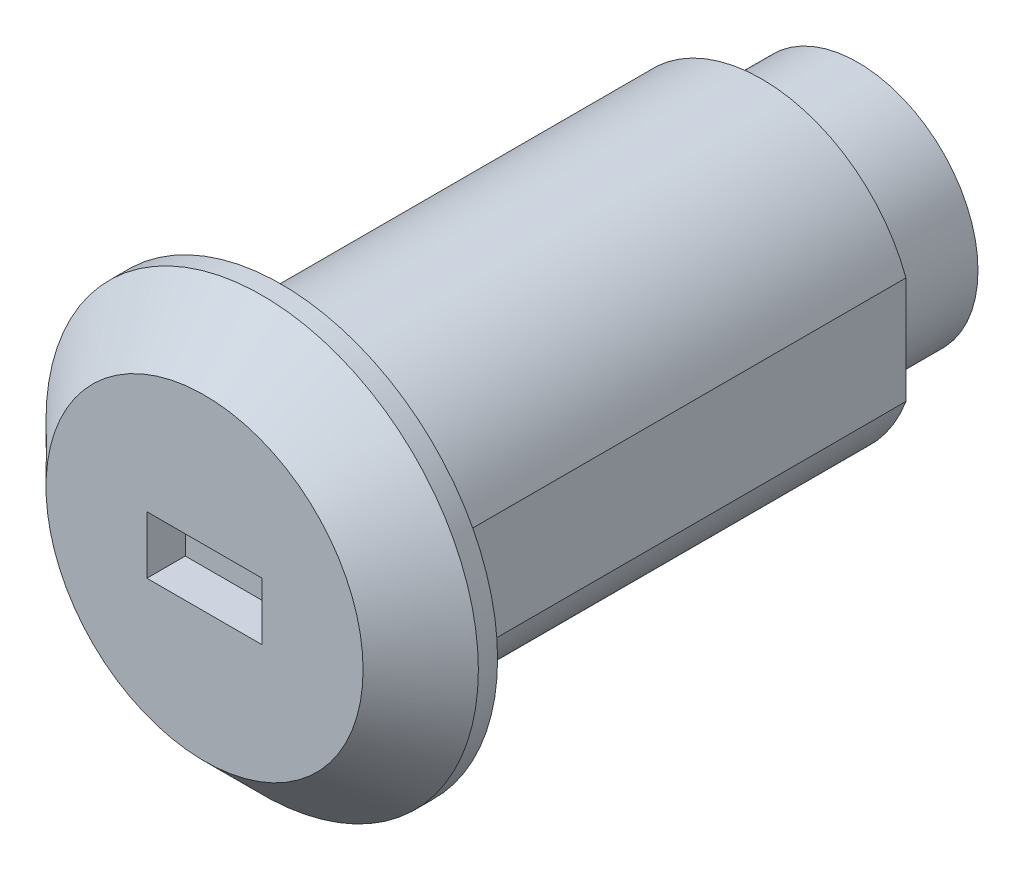
ISO-10303-21;
HEADER;
FILE_DESCRIPTION(('STEP AP214'),'2;1');
FILE_NAME('part.step','',(''),(''),'','','');
FILE_SCHEMA(('AUTOMOTIVE_DESIGN { 1 0 10303 214 1 1 1 1 }'));
ENDSEC;
DATA;
#1=APPLICATION_CONTEXT('core data for automotive mechanical design processes');
#2=APPLICATION_PROTOCOL_DEFINITION('international standard','automotive_design',2000,#1);
#3=PRODUCT_CONTEXT('',#1,'mechanical');
#4=PRODUCT('Part','Part','',(#3));
#5=PRODUCT_RELATED_PRODUCT_CATEGORY('part','',(#4));
#6=PRODUCT_DEFINITION_FORMATION('','',#4);
#7=PRODUCT_DEFINITION_CONTEXT('part definition',#1,'design');
#8=PRODUCT_DEFINITION('design','',#6,#7);
#9=PRODUCT_DEFINITION_SHAPE('','',#8);
#10=(LENGTH_UNIT() NAMED_UNIT(*) SI_UNIT(.MILLI.,.METRE.));
#11=(NAMED_UNIT(*) PLANE_ANGLE_UNIT() SI_UNIT($,.RADIAN.));
#12=(NAMED_UNIT(*) SI_UNIT($,.STERADIAN.) SOLID_ANGLE_UNIT());
#13=UNCERTAINTY_MEASURE_WITH_UNIT(LENGTH_MEASURE(1.E-05),#10,'distance_accuracy_value','');
#14=(GEOMETRIC_REPRESENTATION_CONTEXT(3) GLOBAL_UNCERTAINTY_ASSIGNED_CONTEXT((#13)) GLOBAL_UNIT_ASSIGNED_CONTEXT((#10,
#11,#12)) REPRESENTATION_CONTEXT('',''));
#15=CARTESIAN_POINT('',(0.,0.,0.));
#16=DIRECTION('',(0.,0.,1.));
#17=DIRECTION('',(1.,0.,0.));
#18=AXIS2_PLACEMENT_3D('',#15,#16,#17);
#19=CARTESIAN_POINT('',(0.,0.,-25.));
#20=DIRECTION('',(0.,0.,-1.));
#21=DIRECTION('',(-1.,0.,0.));
#22=AXIS2_PLACEMENT_3D('',#19,#20,#21);
#23=PLANE('',#22);
#24=CARTESIAN_POINT('',(0.,0.,-25.));
#25=DIRECTION('',(0.,0.,-1.));
#26=DIRECTION('',(-1.,0.,0.));
#27=AXIS2_PLACEMENT_3D('',#24,#25,#26);
#28=CIRCLE('',#27,8.);
#29=CARTESIAN_POINT('',(-7.5,2.78388218141502,-25.));
#30=VERTEX_POINT('',#29);
#31=CARTESIAN_POINT('',(7.5,2.78388218141502,-25.));
#32=VERTEX_POINT('',#31);
#33=EDGE_CURVE('E111',#30,#32,#28,.T.);
#34=ORIENTED_EDGE('',*,*,#33,.T.);
#35=DIRECTION('',(0.,-1.,0.));
#36=VECTOR('',#35,1.);
#37=CARTESIAN_POINT('',(7.5,2.78388218141502,-25.));
#38=LINE('',#37,#36);
#39=CARTESIAN_POINT('',(7.5,-2.78388218141502,-25.));
#40=VERTEX_POINT('',#39);
#41=EDGE_CURVE('E338',#32,#40,#38,.T.);
#42=ORIENTED_EDGE('',*,*,#41,.T.);
#43=CARTESIAN_POINT('',(0.,0.,-25.));
#44=DIRECTION('',(0.,0.,-1.));
#45=DIRECTION('',(-1.,0.,0.));
#46=AXIS2_PLACEMENT_3D('',#43,#44,#45);
#47=CIRCLE('',#46,8.);
#48=CARTESIAN_POINT('',(-7.5,-2.78388218141501,-25.));
#49=VERTEX_POINT('',#48);
#50=EDGE_CURVE('E119',#40,#49,#47,.T.);
#51=ORIENTED_EDGE('',*,*,#50,.T.);
#52=DIRECTION('',(0.,1.,0.));
#53=VECTOR('',#52,1.);
#54=CARTESIAN_POINT('',(-7.5,2.78388218141502,-25.));
#55=LINE('',#54,#53);
#56=EDGE_CURVE('E115',#49,#30,#55,.T.);
#57=ORIENTED_EDGE('',*,*,#56,.T.);
#58=EDGE_LOOP('',(#34,#42,#51,#57));
#59=FACE_BOUND('',#58,.T.);
#60=CARTESIAN_POINT('',(0.,0.,-25.));
#61=DIRECTION('',(0.,0.,-1.));
#62=DIRECTION('',(-1.,0.,0.));
#63=AXIS2_PLACEMENT_3D('',#60,#61,#62);
#64=CIRCLE('',#63,6.25);
#65=CARTESIAN_POINT('',(-6.25,0.,-25.));
#66=VERTEX_POINT('',#65);
#67=EDGE_CURVE('E330',#66,#66,#64,.T.);
#68=ORIENTED_EDGE('',*,*,#67,.F.);
#69=EDGE_LOOP('',(#68));
#70=FACE_BOUND('',#69,.T.);
#71=ADVANCED_FACE('F32',(#59,#70),#23,.T.);
#72=CARTESIAN_POINT('',(0.,0.,0.));
#73=DIRECTION('',(0.,0.,1.));
#74=DIRECTION('',(1.,0.,0.));
#75=AXIS2_PLACEMENT_3D('',#72,#73,#74);
#76=PLANE('',#75);
#77=CARTESIAN_POINT('',(0.,0.,0.));
#78=DIRECTION('',(0.,0.,1.));
#79=DIRECTION('',(1.,0.,0.));
#80=AXIS2_PLACEMENT_3D('',#77,#78,#79);
#81=CIRCLE('',#80,11.25);
#82=CARTESIAN_POINT('',(11.25,0.,0.));
#83=VERTEX_POINT('',#82);
#84=EDGE_CURVE('E153',#83,#83,#81,.T.);
#85=ORIENTED_EDGE('',*,*,#84,.F.);
#86=EDGE_LOOP('',(#85));
#87=FACE_BOUND('',#86,.T.);
#88=CARTESIAN_POINT('',(0.,0.,0.));
#89=DIRECTION('',(0.,0.,-1.));
#90=DIRECTION('',(-1.,0.,0.));
#91=AXIS2_PLACEMENT_3D('',#88,#89,#90);
#92=CIRCLE('',#91,8.);
#93=CARTESIAN_POINT('',(-7.5,2.78388218141502,0.));
#94=VERTEX_POINT('',#93);
#95=CARTESIAN_POINT('',(7.5,2.78388218141502,0.));
#96=VERTEX_POINT('',#95);
#97=EDGE_CURVE('E93',#94,#96,#92,.T.);
#98=ORIENTED_EDGE('',*,*,#97,.F.);
#99=DIRECTION('',(0.,1.,0.));
#100=VECTOR('',#99,1.);
#101=CARTESIAN_POINT('',(-7.5,2.78388218141502,0.));
#102=LINE('',#101,#100);
#103=CARTESIAN_POINT('',(-7.5,-2.78388218141501,0.));
#104=VERTEX_POINT('',#103);
#105=EDGE_CURVE('E96',#104,#94,#102,.T.);
#106=ORIENTED_EDGE('',*,*,#105,.F.);
#107=CARTESIAN_POINT('',(0.,0.,0.));
#108=DIRECTION('',(0.,0.,-1.));
#109=DIRECTION('',(-1.,0.,0.));
#110=AXIS2_PLACEMENT_3D('',#107,#108,#109);
#111=CIRCLE('',#110,8.);
#112=CARTESIAN_POINT('',(7.5,-2.78388218141502,0.));
#113=VERTEX_POINT('',#112);
#114=EDGE_CURVE('E52',#113,#104,#111,.T.);
#115=ORIENTED_EDGE('',*,*,#114,.F.);
#116=DIRECTION('',(0.,-1.,0.));
#117=VECTOR('',#116,1.);
#118=CARTESIAN_POINT('',(7.5,2.78388218141502,0.));
#119=LINE('',#118,#117);
#120=EDGE_CURVE('E47',#96,#113,#119,.T.);
#121=ORIENTED_EDGE('',*,*,#120,.F.);
#122=EDGE_LOOP('',(#98,#106,#115,#121));
#123=FACE_BOUND('',#122,.T.);
#124=ADVANCED_FACE('F95',(#87,#123),#76,.F.);
#125=CARTESIAN_POINT('',(0.,0.,4.));
#126=DIRECTION('',(0.,0.,-1.));
#127=DIRECTION('',(-1.,0.,0.));
#128=AXIS2_PLACEMENT_3D('',#125,#126,#127);
#129=CYLINDRICAL_SURFACE('',#128,11.25);
#130=CARTESIAN_POINT('',(0.,0.,0.999999999999984));
#131=DIRECTION('',(0.,0.,1.));
#132=DIRECTION('',(1.,0.,0.));
#133=AXIS2_PLACEMENT_3D('',#130,#131,#132);
#134=CIRCLE('',#133,11.25);
#135=CARTESIAN_POINT('',(11.25,0.,0.999999999999984));
#136=VERTEX_POINT('',#135);
#137=EDGE_CURVE('E11',#136,#136,#134,.F.);
#138=ORIENTED_EDGE('',*,*,#137,.T.);
#139=EDGE_LOOP('',(#138));
#140=FACE_BOUND('',#139,.T.);
#141=ORIENTED_EDGE('',*,*,#84,.T.);
#142=EDGE_LOOP('',(#141));
#143=FACE_BOUND('',#142,.T.);
#144=ADVANCED_FACE('F34',(#140,#143),#129,.T.);
#145=CARTESIAN_POINT('',(0.,0.,4.));
#146=DIRECTION('',(0.,0.,1.));
#147=DIRECTION('',(1.,0.,0.));
#148=AXIS2_PLACEMENT_3D('',#145,#146,#147);
#149=PLANE('',#148);
#150=DIRECTION('',(0.,-1.,0.));
#151=VECTOR('',#150,1.);
#152=CARTESIAN_POINT('',(-3.,1.5,4.));
#153=LINE('',#152,#151);
#154=CARTESIAN_POINT('',(-3.,1.5,4.));
#155=VERTEX_POINT('',#154);
#156=CARTESIAN_POINT('',(-3.,-1.5,4.));
#157=VERTEX_POINT('',#156);
#158=EDGE_CURVE('E127',#155,#157,#153,.T.);
#159=ORIENTED_EDGE('',*,*,#158,.F.);
#160=DIRECTION('',(-1.,0.,0.));
#161=VECTOR('',#160,1.);
#162=CARTESIAN_POINT('',(-3.,1.5,4.));
#163=LINE('',#162,#161);
#164=CARTESIAN_POINT('',(3.,1.5,4.));
#165=VERTEX_POINT('',#164);
#166=EDGE_CURVE('E135',#165,#155,#163,.T.);
#167=ORIENTED_EDGE('',*,*,#166,.F.);
#168=DIRECTION('',(0.,1.,0.));
#169=VECTOR('',#168,1.);
#170=CARTESIAN_POINT('',(3.,1.5,4.));
#171=LINE('',#170,#169);
#172=CARTESIAN_POINT('',(3.,-1.5,4.));
#173=VERTEX_POINT('',#172);
#174=EDGE_CURVE('E132',#173,#165,#171,.T.);
#175=ORIENTED_EDGE('',*,*,#174,.F.);
#176=DIRECTION('',(1.,0.,0.));
#177=VECTOR('',#176,1.);
#178=CARTESIAN_POINT('',(-3.,-1.5,4.));
#179=LINE('',#178,#177);
#180=EDGE_CURVE('E129',#157,#173,#179,.T.);
#181=ORIENTED_EDGE('',*,*,#180,.F.);
#182=EDGE_LOOP('',(#159,#167,#175,#181));
#183=FACE_BOUND('',#182,.T.);
#184=CARTESIAN_POINT('',(0.,0.,4.));
#185=DIRECTION('',(0.,0.,1.));
#186=DIRECTION('',(1.,0.,0.));
#187=AXIS2_PLACEMENT_3D('',#184,#185,#186);
#188=CIRCLE('',#187,8.24999999999999);
#189=CARTESIAN_POINT('',(8.24999999999999,0.,4.));
#190=VERTEX_POINT('',#189);
#191=EDGE_CURVE('E40',#190,#190,#188,.T.);
#192=ORIENTED_EDGE('',*,*,#191,.T.);
#193=EDGE_LOOP('',(#192));
#194=FACE_BOUND('',#193,.T.);
#195=ADVANCED_FACE('F164',(#183,#194),#149,.T.);
#196=CARTESIAN_POINT('',(0.,0.,4.));
#197=DIRECTION('',(0.,0.,-1.));
#198=DIRECTION('',(-1.,0.,0.));
#199=AXIS2_PLACEMENT_3D('',#196,#197,#198);
#200=CONICAL_SURFACE('',#199,8.24999999999999,0.785398163397447);
#201=ORIENTED_EDGE('',*,*,#137,.F.);
#202=EDGE_LOOP('',(#201));
#203=FACE_BOUND('',#202,.T.);
#204=ORIENTED_EDGE('',*,*,#191,.F.);
#205=EDGE_LOOP('',(#204));
#206=FACE_BOUND('',#205,.T.);
#207=ADVANCED_FACE('F166',(#203,#206),#200,.T.);
#208=CARTESIAN_POINT('',(-3.,1.5,2.));
#209=DIRECTION('',(-1.,0.,0.));
#210=DIRECTION('',(0.,0.,1.));
#211=AXIS2_PLACEMENT_3D('',#208,#209,#210);
#212=PLANE('',#211);
#213=ORIENTED_EDGE('',*,*,#158,.T.);
#214=DIRECTION('',(0.,0.,1.));
#215=VECTOR('',#214,1.);
#216=CARTESIAN_POINT('',(-3.,-1.5,2.));
#217=LINE('',#216,#215);
#218=CARTESIAN_POINT('',(-3.,-1.5,2.));
#219=VERTEX_POINT('',#218);
#220=EDGE_CURVE('E150',#219,#157,#217,.T.);
#221=ORIENTED_EDGE('',*,*,#220,.F.);
#222=DIRECTION('',(0.,-1.,0.));
#223=VECTOR('',#222,1.);
#224=CARTESIAN_POINT('',(-3.,1.5,2.));
#225=LINE('',#224,#223);
#226=CARTESIAN_POINT('',(-3.,1.5,2.));
#227=VERTEX_POINT('',#226);
#228=EDGE_CURVE('E138',#227,#219,#225,.T.);
#229=ORIENTED_EDGE('',*,*,#228,.F.);
#230=DIRECTION('',(0.,0.,1.));
#231=VECTOR('',#230,1.);
#232=CARTESIAN_POINT('',(-3.,1.5,2.));
#233=LINE('',#232,#231);
#234=EDGE_CURVE('E151',#227,#155,#233,.T.);
#235=ORIENTED_EDGE('',*,*,#234,.T.);
#236=EDGE_LOOP('',(#213,#221,#229,#235));
#237=FACE_BOUND('',#236,.T.);
#238=ADVANCED_FACE('F168',(#237),#212,.F.);
#239=CARTESIAN_POINT('',(-3.,1.5,2.));
#240=DIRECTION('',(0.,1.,0.));
#241=DIRECTION('',(-1.,0.,0.));
#242=AXIS2_PLACEMENT_3D('',#239,#240,#241);
#243=PLANE('',#242);
#244=ORIENTED_EDGE('',*,*,#166,.T.);
#245=ORIENTED_EDGE('',*,*,#234,.F.);
#246=DIRECTION('',(-1.,0.,0.));
#247=VECTOR('',#246,1.);
#248=CARTESIAN_POINT('',(-3.,1.5,2.));
#249=LINE('',#248,#247);
#250=CARTESIAN_POINT('',(3.,1.5,2.));
#251=VERTEX_POINT('',#250);
#252=EDGE_CURVE('E147',#251,#227,#249,.T.);
#253=ORIENTED_EDGE('',*,*,#252,.F.);
#254=DIRECTION('',(0.,0.,1.));
#255=VECTOR('',#254,1.);
#256=CARTESIAN_POINT('',(3.,1.5,2.));
#257=LINE('',#256,#255);
#258=EDGE_CURVE('E154',#251,#165,#257,.T.);
#259=ORIENTED_EDGE('',*,*,#258,.T.);
#260=EDGE_LOOP('',(#244,#245,#253,#259));
#261=FACE_BOUND('',#260,.T.);
#262=ADVANCED_FACE('F175',(#261),#243,.F.);
#263=CARTESIAN_POINT('',(3.,1.5,2.));
#264=DIRECTION('',(1.,0.,0.));
#265=DIRECTION('',(0.,1.,0.));
#266=AXIS2_PLACEMENT_3D('',#263,#264,#265);
#267=PLANE('',#266);
#268=ORIENTED_EDGE('',*,*,#174,.T.);
#269=ORIENTED_EDGE('',*,*,#258,.F.);
#270=DIRECTION('',(0.,1.,0.));
#271=VECTOR('',#270,1.);
#272=CARTESIAN_POINT('',(3.,1.5,2.));
#273=LINE('',#272,#271);
#274=CARTESIAN_POINT('',(3.,-1.5,2.));
#275=VERTEX_POINT('',#274);
#276=EDGE_CURVE('E144',#275,#251,#273,.T.);
#277=ORIENTED_EDGE('',*,*,#276,.F.);
#278=DIRECTION('',(0.,0.,1.));
#279=VECTOR('',#278,1.);
#280=CARTESIAN_POINT('',(3.,-1.5,2.));
#281=LINE('',#280,#279);
#282=EDGE_CURVE('E156',#275,#173,#281,.T.);
#283=ORIENTED_EDGE('',*,*,#282,.T.);
#284=EDGE_LOOP('',(#268,#269,#277,#283));
#285=FACE_BOUND('',#284,.T.);
#286=ADVANCED_FACE('F212',(#285),#267,.F.);
#287=CARTESIAN_POINT('',(-3.,-1.5,2.));
#288=DIRECTION('',(0.,-1.,0.));
#289=DIRECTION('',(1.,0.,0.));
#290=AXIS2_PLACEMENT_3D('',#287,#288,#289);
#291=PLANE('',#290);
#292=ORIENTED_EDGE('',*,*,#180,.T.);
#293=ORIENTED_EDGE('',*,*,#282,.F.);
#294=DIRECTION('',(1.,0.,0.));
#295=VECTOR('',#294,1.);
#296=CARTESIAN_POINT('',(-3.,-1.5,2.));
#297=LINE('',#296,#295);
#298=EDGE_CURVE('E141',#219,#275,#297,.T.);
#299=ORIENTED_EDGE('',*,*,#298,.F.);
#300=ORIENTED_EDGE('',*,*,#220,.T.);
#301=EDGE_LOOP('',(#292,#293,#299,#300));
#302=FACE_BOUND('',#301,.T.);
#303=ADVANCED_FACE('F208',(#302),#291,.F.);
#304=CARTESIAN_POINT('',(-3.,-1.5,2.));
#305=DIRECTION('',(0.,0.,1.));
#306=DIRECTION('',(1.,0.,0.));
#307=AXIS2_PLACEMENT_3D('',#304,#305,#306);
#308=PLANE('',#307);
#309=ORIENTED_EDGE('',*,*,#228,.T.);
#310=ORIENTED_EDGE('',*,*,#298,.T.);
#311=ORIENTED_EDGE('',*,*,#276,.T.);
#312=ORIENTED_EDGE('',*,*,#252,.T.);
#313=EDGE_LOOP('',(#309,#310,#311,#312));
#314=FACE_BOUND('',#313,.T.);
#315=ADVANCED_FACE('F205',(#314),#308,.T.);
#316=CARTESIAN_POINT('',(0.,0.,-25.));
#317=DIRECTION('',(0.,0.,1.));
#318=DIRECTION('',(1.,0.,0.));
#319=AXIS2_PLACEMENT_3D('',#316,#317,#318);
#320=CYLINDRICAL_SURFACE('',#319,8.);
#321=ORIENTED_EDGE('',*,*,#97,.T.);
#322=DIRECTION('',(0.,0.,1.));
#323=VECTOR('',#322,1.);
#324=CARTESIAN_POINT('',(7.5,2.78388218141502,-25.));
#325=LINE('',#324,#323);
#326=EDGE_CURVE('E125',#32,#96,#325,.T.);
#327=ORIENTED_EDGE('',*,*,#326,.F.);
#328=ORIENTED_EDGE('',*,*,#33,.F.);
#329=DIRECTION('',(0.,0.,1.));
#330=VECTOR('',#329,1.);
#331=CARTESIAN_POINT('',(-7.5,2.78388218141502,-25.));
#332=LINE('',#331,#330);
#333=EDGE_CURVE('E107',#30,#94,#332,.T.);
#334=ORIENTED_EDGE('',*,*,#333,.T.);
#335=EDGE_LOOP('',(#321,#327,#328,#334));
#336=FACE_BOUND('',#335,.T.);
#337=ADVANCED_FACE('F113',(#336),#320,.T.);
#338=CARTESIAN_POINT('',(7.5,2.78388218141502,-25.));
#339=DIRECTION('',(-1.,0.,0.));
#340=DIRECTION('',(0.,0.,1.));
#341=AXIS2_PLACEMENT_3D('',#338,#339,#340);
#342=PLANE('',#341);
#343=ORIENTED_EDGE('',*,*,#120,.T.);
#344=DIRECTION('',(0.,0.,1.));
#345=VECTOR('',#344,1.);
#346=CARTESIAN_POINT('',(7.5,-2.78388218141502,-25.));
#347=LINE('',#346,#345);
#348=EDGE_CURVE('E117',#40,#113,#347,.T.);
#349=ORIENTED_EDGE('',*,*,#348,.F.);
#350=ORIENTED_EDGE('',*,*,#41,.F.);
#351=ORIENTED_EDGE('',*,*,#326,.T.);
#352=EDGE_LOOP('',(#343,#349,#350,#351));
#353=FACE_BOUND('',#352,.T.);
#354=ADVANCED_FACE('F198',(#353),#342,.F.);
#355=CARTESIAN_POINT('',(0.,0.,-25.));
#356=DIRECTION('',(0.,0.,1.));
#357=DIRECTION('',(1.,0.,0.));
#358=AXIS2_PLACEMENT_3D('',#355,#356,#357);
#359=CYLINDRICAL_SURFACE('',#358,8.);
#360=ORIENTED_EDGE('',*,*,#114,.T.);
#361=DIRECTION('',(0.,0.,1.));
#362=VECTOR('',#361,1.);
#363=CARTESIAN_POINT('',(-7.5,-2.78388218141501,-25.));
#364=LINE('',#363,#362);
#365=EDGE_CURVE('E110',#49,#104,#364,.T.);
#366=ORIENTED_EDGE('',*,*,#365,.F.);
#367=ORIENTED_EDGE('',*,*,#50,.F.);
#368=ORIENTED_EDGE('',*,*,#348,.T.);
#369=EDGE_LOOP('',(#360,#366,#367,#368));
#370=FACE_BOUND('',#369,.T.);
#371=ADVANCED_FACE('F195',(#370),#359,.T.);
#372=CARTESIAN_POINT('',(-7.5,2.78388218141502,-25.));
#373=DIRECTION('',(1.,0.,0.));
#374=DIRECTION('',(0.,1.,0.));
#375=AXIS2_PLACEMENT_3D('',#372,#373,#374);
#376=PLANE('',#375);
#377=ORIENTED_EDGE('',*,*,#105,.T.);
#378=ORIENTED_EDGE('',*,*,#333,.F.);
#379=ORIENTED_EDGE('',*,*,#56,.F.);
#380=ORIENTED_EDGE('',*,*,#365,.T.);
#381=EDGE_LOOP('',(#377,#378,#379,#380));
#382=FACE_BOUND('',#381,.T.);
#383=ADVANCED_FACE('F105',(#382),#376,.F.);
#384=CARTESIAN_POINT('',(0.,0.,-30.));
#385=DIRECTION('',(0.,0.,1.));
#386=DIRECTION('',(1.,0.,0.));
#387=AXIS2_PLACEMENT_3D('',#384,#385,#386);
#388=CYLINDRICAL_SURFACE('',#387,6.25);
#389=CARTESIAN_POINT('',(0.,0.,-30.));
#390=DIRECTION('',(0.,0.,-1.));
#391=DIRECTION('',(-1.,0.,0.));
#392=AXIS2_PLACEMENT_3D('',#389,#390,#391);
#393=CIRCLE('',#392,6.25);
#394=CARTESIAN_POINT('',(-6.25,0.,-30.));
#395=VERTEX_POINT('',#394);
#396=EDGE_CURVE('E100',#395,#395,#393,.T.);
#397=ORIENTED_EDGE('',*,*,#396,.F.);
#398=EDGE_LOOP('',(#397));
#399=FACE_BOUND('',#398,.T.);
#400=ORIENTED_EDGE('',*,*,#67,.T.);
#401=EDGE_LOOP('',(#400));
#402=FACE_BOUND('',#401,.T.);
#403=ADVANCED_FACE('F191',(#399,#402),#388,.T.);
#404=CARTESIAN_POINT('',(0.,0.,-30.));
#405=DIRECTION('',(0.,0.,-1.));
#406=DIRECTION('',(-1.,0.,0.));
#407=AXIS2_PLACEMENT_3D('',#404,#405,#406);
#408=PLANE('',#407);
#409=ORIENTED_EDGE('',*,*,#396,.T.);
#410=EDGE_LOOP('',(#409));
#411=FACE_BOUND('',#410,.T.);
#412=ADVANCED_FACE('F258',(#411),#408,.T.);
#413=CLOSED_SHELL('',(#71,#124,#144,#195,#207,#238,#262,#286,#303,#315,#337,#354,#371,#383,#403,#412));
#414=MANIFOLD_SOLID_BREP('B2',#413);
#415=ADVANCED_BREP_SHAPE_REPRESENTATION('',(#18,#414),#14);
#416=SHAPE_DEFINITION_REPRESENTATION(#9,#415);
ENDSEC;
END-ISO-10303-21;
